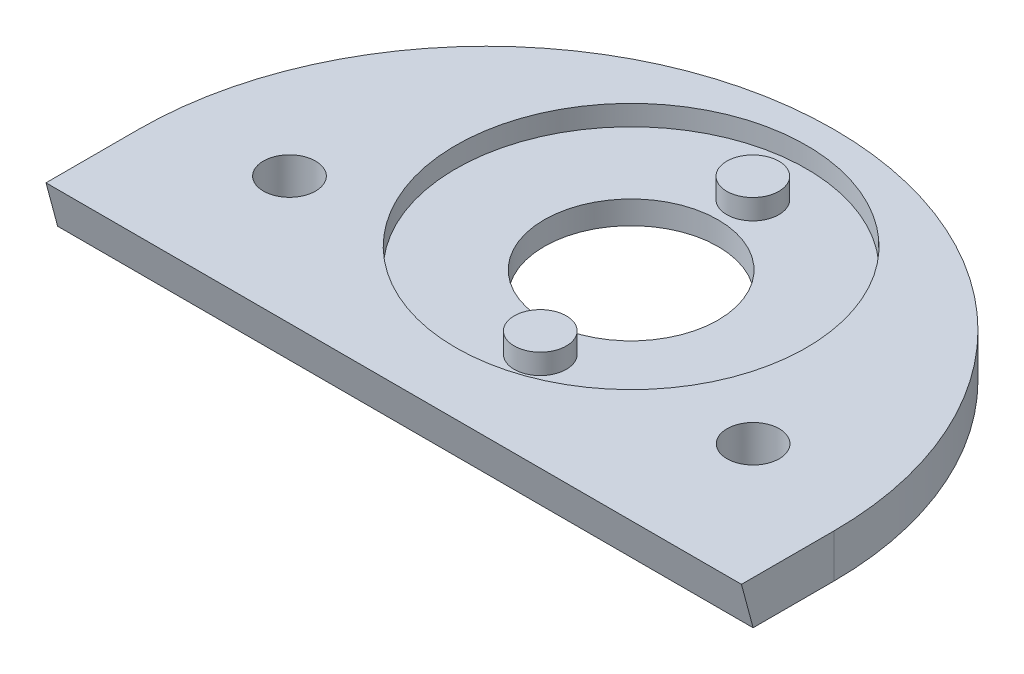
ISO-10303-21;
HEADER;
FILE_DESCRIPTION(('STEP AP214'),'2;1');
FILE_NAME('part.step','',(''),(''),'','','');
FILE_SCHEMA(('AUTOMOTIVE_DESIGN { 1 0 10303 214 1 1 1 1 }'));
ENDSEC;
DATA;
#1=APPLICATION_CONTEXT('core data for automotive mechanical design processes');
#2=APPLICATION_PROTOCOL_DEFINITION('international standard','automotive_design',2000,#1);
#3=PRODUCT_CONTEXT('',#1,'mechanical');
#4=PRODUCT('Part','Part','',(#3));
#5=PRODUCT_RELATED_PRODUCT_CATEGORY('part','',(#4));
#6=PRODUCT_DEFINITION_FORMATION('','',#4);
#7=PRODUCT_DEFINITION_CONTEXT('part definition',#1,'design');
#8=PRODUCT_DEFINITION('design','',#6,#7);
#9=PRODUCT_DEFINITION_SHAPE('','',#8);
#10=(LENGTH_UNIT() NAMED_UNIT(*) SI_UNIT(.MILLI.,.METRE.));
#11=(NAMED_UNIT(*) PLANE_ANGLE_UNIT() SI_UNIT($,.RADIAN.));
#12=(NAMED_UNIT(*) SI_UNIT($,.STERADIAN.) SOLID_ANGLE_UNIT());
#13=UNCERTAINTY_MEASURE_WITH_UNIT(LENGTH_MEASURE(1.E-05),#10,'distance_accuracy_value','');
#14=(GEOMETRIC_REPRESENTATION_CONTEXT(3) GLOBAL_UNCERTAINTY_ASSIGNED_CONTEXT((#13)) GLOBAL_UNIT_ASSIGNED_CONTEXT((#10,
#11,#12)) REPRESENTATION_CONTEXT('',''));
#15=CARTESIAN_POINT('',(0.,0.,0.));
#16=DIRECTION('',(0.,0.,1.));
#17=DIRECTION('',(1.,0.,0.));
#18=AXIS2_PLACEMENT_3D('',#15,#16,#17);
#19=CARTESIAN_POINT('',(30.,2.,0.));
#20=DIRECTION('',(-1.,0.,0.));
#21=DIRECTION('',(0.,0.,1.));
#22=AXIS2_PLACEMENT_3D('',#19,#20,#21);
#23=PLANE('',#22);
#24=DIRECTION('',(0.,0.,-1.));
#25=VECTOR('',#24,1.);
#26=CARTESIAN_POINT('',(30.,3.75,0.));
#27=LINE('',#26,#25);
#28=CARTESIAN_POINT('',(30.,3.75,2.02674000308269));
#29=VERTEX_POINT('',#28);
#30=CARTESIAN_POINT('',(30.,3.75,-5.95402211045046));
#31=VERTEX_POINT('',#30);
#32=EDGE_CURVE('E101',#29,#31,#27,.T.);
#33=ORIENTED_EDGE('',*,*,#32,.F.);
#34=DIRECTION('',(0.,-0.965925826289068,-0.258819045102521));
#35=VECTOR('',#34,1.);
#36=CARTESIAN_POINT('',(30.,18.75,6.04597788954954));
#37=LINE('',#36,#35);
#38=CARTESIAN_POINT('',(30.,0.,1.02193053146598));
#39=VERTEX_POINT('',#38);
#40=EDGE_CURVE('E64',#29,#39,#37,.T.);
#41=ORIENTED_EDGE('',*,*,#40,.T.);
#42=DIRECTION('',(0.,0.,-1.));
#43=VECTOR('',#42,1.);
#44=CARTESIAN_POINT('',(30.,0.,0.));
#45=LINE('',#44,#43);
#46=CARTESIAN_POINT('',(30.,0.,-5.95402211045046));
#47=VERTEX_POINT('',#46);
#48=EDGE_CURVE('E100',#39,#47,#45,.T.);
#49=ORIENTED_EDGE('',*,*,#48,.T.);
#50=DIRECTION('',(0.,-1.,0.));
#51=VECTOR('',#50,1.);
#52=CARTESIAN_POINT('',(30.,2.,-5.95402211045046));
#53=LINE('',#52,#51);
#54=EDGE_CURVE('E125',#31,#47,#53,.T.);
#55=ORIENTED_EDGE('',*,*,#54,.F.);
#56=EDGE_LOOP('',(#33,#41,#49,#55));
#57=FACE_BOUND('',#56,.T.);
#58=ADVANCED_FACE('F47',(#57),#23,.F.);
#59=CARTESIAN_POINT('',(0.,2.,-5.95402211045046));
#60=DIRECTION('',(0.,-1.,0.));
#61=DIRECTION('',(0.,0.,-1.));
#62=AXIS2_PLACEMENT_3D('',#59,#60,#61);
#63=CYLINDRICAL_SURFACE('',#62,30.);
#64=CARTESIAN_POINT('',(0.,0.,-5.95402211045046));
#65=DIRECTION('',(0.,1.,0.));
#66=DIRECTION('',(0.,0.,1.));
#67=AXIS2_PLACEMENT_3D('',#64,#65,#66);
#68=CIRCLE('',#67,30.);
#69=CARTESIAN_POINT('',(-30.,0.,-5.95402211045046));
#70=VERTEX_POINT('',#69);
#71=EDGE_CURVE('E106',#47,#70,#68,.T.);
#72=ORIENTED_EDGE('',*,*,#71,.T.);
#73=DIRECTION('',(0.,-1.,0.));
#74=VECTOR('',#73,1.);
#75=CARTESIAN_POINT('',(-30.,2.,-5.95402211045046));
#76=LINE('',#75,#74);
#77=CARTESIAN_POINT('',(-30.,3.75,-5.95402211045046));
#78=VERTEX_POINT('',#77);
#79=EDGE_CURVE('E122',#78,#70,#76,.T.);
#80=ORIENTED_EDGE('',*,*,#79,.F.);
#81=CARTESIAN_POINT('',(0.,3.75,-5.95402211045046));
#82=DIRECTION('',(0.,1.,0.));
#83=DIRECTION('',(0.,0.,1.));
#84=AXIS2_PLACEMENT_3D('',#81,#82,#83);
#85=CIRCLE('',#84,30.);
#86=EDGE_CURVE('E171',#31,#78,#85,.T.);
#87=ORIENTED_EDGE('',*,*,#86,.F.);
#88=ORIENTED_EDGE('',*,*,#54,.T.);
#89=EDGE_LOOP('',(#72,#80,#87,#88));
#90=FACE_BOUND('',#89,.T.);
#91=ADVANCED_FACE('F200',(#90),#63,.T.);
#92=CARTESIAN_POINT('',(-30.,2.,0.));
#93=DIRECTION('',(-1.,0.,0.));
#94=DIRECTION('',(0.,0.,1.));
#95=AXIS2_PLACEMENT_3D('',#92,#93,#94);
#96=PLANE('',#95);
#97=DIRECTION('',(0.,-0.965925826289068,-0.258819045102521));
#98=VECTOR('',#97,1.);
#99=CARTESIAN_POINT('',(-30.,18.75,6.04597788954954));
#100=LINE('',#99,#98);
#101=CARTESIAN_POINT('',(-30.,3.75,2.02674000308269));
#102=VERTEX_POINT('',#101);
#103=CARTESIAN_POINT('',(-30.,0.,1.02193053146598));
#104=VERTEX_POINT('',#103);
#105=EDGE_CURVE('E92',#102,#104,#100,.T.);
#106=ORIENTED_EDGE('',*,*,#105,.F.);
#107=DIRECTION('',(0.,0.,1.));
#108=VECTOR('',#107,1.);
#109=CARTESIAN_POINT('',(-30.,3.75,0.));
#110=LINE('',#109,#108);
#111=EDGE_CURVE('E115',#78,#102,#110,.T.);
#112=ORIENTED_EDGE('',*,*,#111,.F.);
#113=ORIENTED_EDGE('',*,*,#79,.T.);
#114=DIRECTION('',(0.,0.,-1.));
#115=VECTOR('',#114,1.);
#116=CARTESIAN_POINT('',(-30.,0.,0.));
#117=LINE('',#116,#115);
#118=EDGE_CURVE('E72',#104,#70,#117,.T.);
#119=ORIENTED_EDGE('',*,*,#118,.F.);
#120=EDGE_LOOP('',(#106,#112,#113,#119));
#121=FACE_BOUND('',#120,.T.);
#122=ADVANCED_FACE('F195',(#121),#96,.T.);
#123=CARTESIAN_POINT('',(0.,2.,-18.4540221104505));
#124=DIRECTION('',(0.,-1.,0.));
#125=DIRECTION('',(0.,0.,-1.));
#126=AXIS2_PLACEMENT_3D('',#123,#124,#125);
#127=CYLINDRICAL_SURFACE('',#126,7.5);
#128=CARTESIAN_POINT('',(0.,2.,-18.4540221104505));
#129=DIRECTION('',(0.,1.,0.));
#130=DIRECTION('',(0.,0.,1.));
#131=AXIS2_PLACEMENT_3D('',#128,#129,#130);
#132=CIRCLE('',#131,7.5);
#133=CARTESIAN_POINT('',(0.,2.,-10.9540221104505));
#134=VERTEX_POINT('',#133);
#135=EDGE_CURVE('E121',#134,#134,#132,.T.);
#136=ORIENTED_EDGE('',*,*,#135,.T.);
#137=EDGE_LOOP('',(#136));
#138=FACE_BOUND('',#137,.T.);
#139=CARTESIAN_POINT('',(0.,0.,-18.4540221104505));
#140=DIRECTION('',(0.,1.,0.));
#141=DIRECTION('',(0.,0.,1.));
#142=AXIS2_PLACEMENT_3D('',#139,#140,#141);
#143=CIRCLE('',#142,7.5);
#144=CARTESIAN_POINT('',(0.,0.,-10.9540221104505));
#145=VERTEX_POINT('',#144);
#146=EDGE_CURVE('E109',#145,#145,#143,.T.);
#147=ORIENTED_EDGE('',*,*,#146,.F.);
#148=EDGE_LOOP('',(#147));
#149=FACE_BOUND('',#148,.T.);
#150=ADVANCED_FACE('F49',(#138,#149),#127,.F.);
#151=CARTESIAN_POINT('',(0.,2.,0.));
#152=DIRECTION('',(0.,1.,0.));
#153=DIRECTION('',(0.,0.,1.));
#154=AXIS2_PLACEMENT_3D('',#151,#152,#153);
#155=PLANE('',#154);
#156=CARTESIAN_POINT('',(0.,2.,-28.9540221104505));
#157=DIRECTION('',(0.,1.,0.));
#158=DIRECTION('',(0.,0.,1.));
#159=AXIS2_PLACEMENT_3D('',#156,#157,#158);
#160=CIRCLE('',#159,2.25);
#161=CARTESIAN_POINT('',(0.,2.,-26.7040221104505));
#162=VERTEX_POINT('',#161);
#163=EDGE_CURVE('E150',#162,#162,#160,.T.);
#164=ORIENTED_EDGE('',*,*,#163,.F.);
#165=EDGE_LOOP('',(#164));
#166=FACE_BOUND('',#165,.T.);
#167=CARTESIAN_POINT('',(2.38717114082106,2.,-8.22898353133345));
#168=DIRECTION('',(0.,1.,0.));
#169=DIRECTION('',(0.,0.,1.));
#170=AXIS2_PLACEMENT_3D('',#167,#168,#169);
#171=CIRCLE('',#170,2.25);
#172=CARTESIAN_POINT('',(2.38717114082106,2.,-5.97898353133345));
#173=VERTEX_POINT('',#172);
#174=EDGE_CURVE('E158',#173,#173,#171,.T.);
#175=ORIENTED_EDGE('',*,*,#174,.F.);
#176=EDGE_LOOP('',(#175));
#177=FACE_BOUND('',#176,.T.);
#178=CARTESIAN_POINT('',(0.,2.,-18.4540221104505));
#179=DIRECTION('',(0.,1.,0.));
#180=DIRECTION('',(0.,0.,1.));
#181=AXIS2_PLACEMENT_3D('',#178,#179,#180);
#182=CIRCLE('',#181,15.125);
#183=CARTESIAN_POINT('',(0.,2.,-3.32902211045046));
#184=VERTEX_POINT('',#183);
#185=EDGE_CURVE('E57',#184,#184,#182,.F.);
#186=ORIENTED_EDGE('',*,*,#185,.F.);
#187=EDGE_LOOP('',(#186));
#188=FACE_BOUND('',#187,.T.);
#189=ORIENTED_EDGE('',*,*,#135,.F.);
#190=EDGE_LOOP('',(#189));
#191=FACE_BOUND('',#190,.T.);
#192=ADVANCED_FACE('F183',(#166,#177,#188,#191),#155,.T.);
#193=CARTESIAN_POINT('',(0.,0.,0.));
#194=DIRECTION('',(0.,1.,0.));
#195=DIRECTION('',(0.,0.,1.));
#196=AXIS2_PLACEMENT_3D('',#193,#194,#195);
#197=PLANE('',#196);
#198=CARTESIAN_POINT('',(-20.,0.,-8.97806946853402));
#199=DIRECTION('',(0.,-1.,0.));
#200=DIRECTION('',(0.,0.,-1.));
#201=AXIS2_PLACEMENT_3D('',#198,#199,#200);
#202=CIRCLE('',#201,2.25);
#203=CARTESIAN_POINT('',(-20.,0.,-11.228069468534));
#204=VERTEX_POINT('',#203);
#205=EDGE_CURVE('E133',#204,#204,#202,.T.);
#206=ORIENTED_EDGE('',*,*,#205,.F.);
#207=EDGE_LOOP('',(#206));
#208=FACE_BOUND('',#207,.T.);
#209=CARTESIAN_POINT('',(20.,0.,-8.97806946853402));
#210=DIRECTION('',(0.,-1.,0.));
#211=DIRECTION('',(0.,0.,-1.));
#212=AXIS2_PLACEMENT_3D('',#209,#210,#211);
#213=CIRCLE('',#212,2.25);
#214=CARTESIAN_POINT('',(20.,0.,-11.228069468534));
#215=VERTEX_POINT('',#214);
#216=EDGE_CURVE('E140',#215,#215,#213,.T.);
#217=ORIENTED_EDGE('',*,*,#216,.F.);
#218=EDGE_LOOP('',(#217));
#219=FACE_BOUND('',#218,.T.);
#220=ORIENTED_EDGE('',*,*,#146,.T.);
#221=EDGE_LOOP('',(#220));
#222=FACE_BOUND('',#221,.T.);
#223=ORIENTED_EDGE('',*,*,#48,.F.);
#224=DIRECTION('',(-1.,0.,0.));
#225=VECTOR('',#224,1.);
#226=CARTESIAN_POINT('',(30.,0.,1.02193053146598));
#227=LINE('',#226,#225);
#228=EDGE_CURVE('E89',#39,#104,#227,.T.);
#229=ORIENTED_EDGE('',*,*,#228,.T.);
#230=ORIENTED_EDGE('',*,*,#118,.T.);
#231=ORIENTED_EDGE('',*,*,#71,.F.);
#232=EDGE_LOOP('',(#223,#229,#230,#231));
#233=FACE_BOUND('',#232,.T.);
#234=ADVANCED_FACE('F104',(#208,#219,#222,#233),#197,.F.);
#235=CARTESIAN_POINT('',(0.,3.75,-18.4540221104505));
#236=DIRECTION('',(0.,-1.,0.));
#237=DIRECTION('',(0.,0.,-1.));
#238=AXIS2_PLACEMENT_3D('',#235,#236,#237);
#239=CYLINDRICAL_SURFACE('',#238,15.125);
#240=CARTESIAN_POINT('',(0.,3.75,-18.4540221104505));
#241=DIRECTION('',(0.,1.,0.));
#242=DIRECTION('',(0.,0.,1.));
#243=AXIS2_PLACEMENT_3D('',#240,#241,#242);
#244=CIRCLE('',#243,15.125);
#245=CARTESIAN_POINT('',(0.,3.75,-3.32902211045046));
#246=VERTEX_POINT('',#245);
#247=EDGE_CURVE('E162',#246,#246,#244,.T.);
#248=ORIENTED_EDGE('',*,*,#247,.T.);
#249=EDGE_LOOP('',(#248));
#250=FACE_BOUND('',#249,.T.);
#251=ORIENTED_EDGE('',*,*,#185,.T.);
#252=EDGE_LOOP('',(#251));
#253=FACE_BOUND('',#252,.T.);
#254=ADVANCED_FACE('F192',(#250,#253),#239,.F.);
#255=CARTESIAN_POINT('',(0.,3.75,0.));
#256=DIRECTION('',(0.,1.,0.));
#257=DIRECTION('',(0.,0.,1.));
#258=AXIS2_PLACEMENT_3D('',#255,#256,#257);
#259=PLANE('',#258);
#260=CARTESIAN_POINT('',(-20.,3.75,-8.97806946853402));
#261=DIRECTION('',(0.,1.,0.));
#262=DIRECTION('',(0.,0.,1.));
#263=AXIS2_PLACEMENT_3D('',#260,#261,#262);
#264=CIRCLE('',#263,2.25);
#265=CARTESIAN_POINT('',(-20.,3.75,-6.72806946853402));
#266=VERTEX_POINT('',#265);
#267=EDGE_CURVE('E51',#266,#266,#264,.T.);
#268=ORIENTED_EDGE('',*,*,#267,.F.);
#269=EDGE_LOOP('',(#268));
#270=FACE_BOUND('',#269,.T.);
#271=CARTESIAN_POINT('',(20.,3.75,-8.97806946853402));
#272=DIRECTION('',(0.,1.,0.));
#273=DIRECTION('',(0.,0.,1.));
#274=AXIS2_PLACEMENT_3D('',#271,#272,#273);
#275=CIRCLE('',#274,2.25);
#276=CARTESIAN_POINT('',(20.,3.75,-6.72806946853402));
#277=VERTEX_POINT('',#276);
#278=EDGE_CURVE('E130',#277,#277,#275,.T.);
#279=ORIENTED_EDGE('',*,*,#278,.F.);
#280=EDGE_LOOP('',(#279));
#281=FACE_BOUND('',#280,.T.);
#282=DIRECTION('',(-1.,0.,0.));
#283=VECTOR('',#282,1.);
#284=CARTESIAN_POINT('',(0.,3.75,2.02674000308269));
#285=LINE('',#284,#283);
#286=EDGE_CURVE('E11',#29,#102,#285,.T.);
#287=ORIENTED_EDGE('',*,*,#286,.F.);
#288=ORIENTED_EDGE('',*,*,#32,.T.);
#289=ORIENTED_EDGE('',*,*,#86,.T.);
#290=ORIENTED_EDGE('',*,*,#111,.T.);
#291=EDGE_LOOP('',(#287,#288,#289,#290));
#292=FACE_BOUND('',#291,.T.);
#293=ORIENTED_EDGE('',*,*,#247,.F.);
#294=EDGE_LOOP('',(#293));
#295=FACE_BOUND('',#294,.T.);
#296=ADVANCED_FACE('F216',(#270,#281,#292,#295),#259,.T.);
#297=CARTESIAN_POINT('',(2.38717114082106,3.75,-8.22898353133345));
#298=DIRECTION('',(0.,-1.,0.));
#299=DIRECTION('',(0.,0.,-1.));
#300=AXIS2_PLACEMENT_3D('',#297,#298,#299);
#301=CYLINDRICAL_SURFACE('',#300,2.25);
#302=CARTESIAN_POINT('',(2.38717114082106,3.75,-8.22898353133345));
#303=DIRECTION('',(0.,1.,0.));
#304=DIRECTION('',(0.,0.,1.));
#305=AXIS2_PLACEMENT_3D('',#302,#303,#304);
#306=CIRCLE('',#305,2.25);
#307=CARTESIAN_POINT('',(2.38717114082106,3.75,-5.97898353133345));
#308=VERTEX_POINT('',#307);
#309=EDGE_CURVE('E154',#308,#308,#306,.T.);
#310=ORIENTED_EDGE('',*,*,#309,.F.);
#311=EDGE_LOOP('',(#310));
#312=FACE_BOUND('',#311,.T.);
#313=ORIENTED_EDGE('',*,*,#174,.T.);
#314=EDGE_LOOP('',(#313));
#315=FACE_BOUND('',#314,.T.);
#316=ADVANCED_FACE('F220',(#312,#315),#301,.T.);
#317=CARTESIAN_POINT('',(0.,3.75,0.));
#318=DIRECTION('',(0.,1.,0.));
#319=DIRECTION('',(0.,0.,1.));
#320=AXIS2_PLACEMENT_3D('',#317,#318,#319);
#321=PLANE('',#320);
#322=ORIENTED_EDGE('',*,*,#309,.T.);
#323=EDGE_LOOP('',(#322));
#324=FACE_BOUND('',#323,.T.);
#325=ADVANCED_FACE('F234',(#324),#321,.T.);
#326=CARTESIAN_POINT('',(0.,3.75,-28.9540221104505));
#327=DIRECTION('',(0.,-1.,0.));
#328=DIRECTION('',(0.,0.,-1.));
#329=AXIS2_PLACEMENT_3D('',#326,#327,#328);
#330=CYLINDRICAL_SURFACE('',#329,2.25);
#331=CARTESIAN_POINT('',(0.,3.75,-28.9540221104505));
#332=DIRECTION('',(0.,1.,0.));
#333=DIRECTION('',(0.,0.,1.));
#334=AXIS2_PLACEMENT_3D('',#331,#332,#333);
#335=CIRCLE('',#334,2.25);
#336=CARTESIAN_POINT('',(0.,3.75,-26.7040221104505));
#337=VERTEX_POINT('',#336);
#338=EDGE_CURVE('E95',#337,#337,#335,.T.);
#339=ORIENTED_EDGE('',*,*,#338,.F.);
#340=EDGE_LOOP('',(#339));
#341=FACE_BOUND('',#340,.T.);
#342=ORIENTED_EDGE('',*,*,#163,.T.);
#343=EDGE_LOOP('',(#342));
#344=FACE_BOUND('',#343,.T.);
#345=ADVANCED_FACE('F237',(#341,#344),#330,.T.);
#346=CARTESIAN_POINT('',(0.,3.75,-28.9540221104505));
#347=DIRECTION('',(0.,1.,0.));
#348=DIRECTION('',(0.,0.,1.));
#349=AXIS2_PLACEMENT_3D('',#346,#347,#348);
#350=PLANE('',#349);
#351=ORIENTED_EDGE('',*,*,#338,.T.);
#352=EDGE_LOOP('',(#351));
#353=FACE_BOUND('',#352,.T.);
#354=ADVANCED_FACE('F242',(#353),#350,.T.);
#355=CARTESIAN_POINT('',(30.,18.75,6.04597788954954));
#356=DIRECTION('',(0.,0.258819045102521,-0.965925826289068));
#357=DIRECTION('',(0.,0.965925826289068,0.258819045102521));
#358=AXIS2_PLACEMENT_3D('',#355,#356,#357);
#359=PLANE('',#358);
#360=ORIENTED_EDGE('',*,*,#286,.T.);
#361=ORIENTED_EDGE('',*,*,#105,.T.);
#362=ORIENTED_EDGE('',*,*,#228,.F.);
#363=ORIENTED_EDGE('',*,*,#40,.F.);
#364=EDGE_LOOP('',(#360,#361,#362,#363));
#365=FACE_BOUND('',#364,.T.);
#366=ADVANCED_FACE('F90',(#365),#359,.F.);
#367=CARTESIAN_POINT('',(20.,20.,-8.97806946853402));
#368=DIRECTION('',(0.,-1.,0.));
#369=DIRECTION('',(0.,0.,-1.));
#370=AXIS2_PLACEMENT_3D('',#367,#368,#369);
#371=CYLINDRICAL_SURFACE('',#370,2.25);
#372=ORIENTED_EDGE('',*,*,#278,.T.);
#373=EDGE_LOOP('',(#372));
#374=FACE_BOUND('',#373,.T.);
#375=ORIENTED_EDGE('',*,*,#216,.T.);
#376=EDGE_LOOP('',(#375));
#377=FACE_BOUND('',#376,.T.);
#378=ADVANCED_FACE('F251',(#374,#377),#371,.F.);
#379=CARTESIAN_POINT('',(-20.,20.,-8.97806946853402));
#380=DIRECTION('',(0.,-1.,0.));
#381=DIRECTION('',(0.,0.,-1.));
#382=AXIS2_PLACEMENT_3D('',#379,#380,#381);
#383=CYLINDRICAL_SURFACE('',#382,2.25);
#384=ORIENTED_EDGE('',*,*,#267,.T.);
#385=EDGE_LOOP('',(#384));
#386=FACE_BOUND('',#385,.T.);
#387=ORIENTED_EDGE('',*,*,#205,.T.);
#388=EDGE_LOOP('',(#387));
#389=FACE_BOUND('',#388,.T.);
#390=ADVANCED_FACE('F254',(#386,#389),#383,.F.);
#391=CLOSED_SHELL('',(#58,#91,#122,#150,#192,#234,#254,#296,#316,#325,#345,#354,#366,#378,#390));
#392=MANIFOLD_SOLID_BREP('B2',#391);
#393=ADVANCED_BREP_SHAPE_REPRESENTATION('',(#18,#392),#14);
#394=SHAPE_DEFINITION_REPRESENTATION(#9,#393);
ENDSEC;
END-ISO-10303-21;
